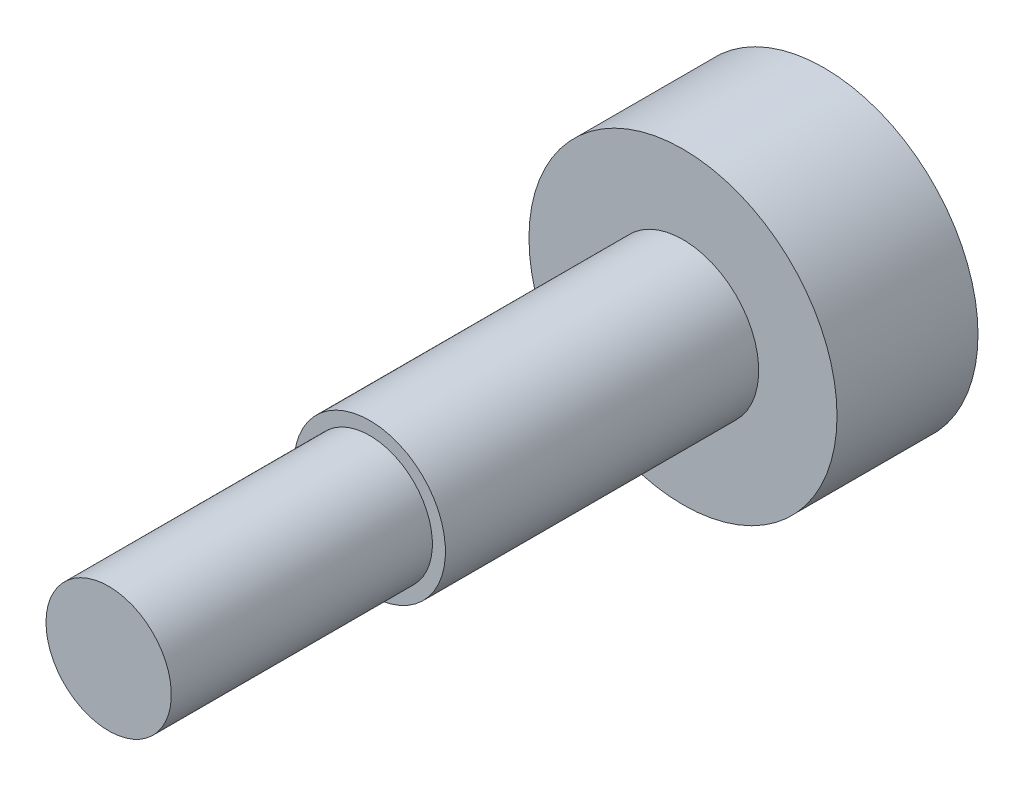
ISO-10303-21;
HEADER;
FILE_DESCRIPTION(('STEP AP214'),'2;1');
FILE_NAME('part.step','',(''),(''),'','','');
FILE_SCHEMA(('AUTOMOTIVE_DESIGN { 1 0 10303 214 1 1 1 1 }'));
ENDSEC;
DATA;
#1=APPLICATION_CONTEXT('core data for automotive mechanical design processes');
#2=APPLICATION_PROTOCOL_DEFINITION('international standard','automotive_design',2000,#1);
#3=PRODUCT_CONTEXT('',#1,'mechanical');
#4=PRODUCT('Part','Part','',(#3));
#5=PRODUCT_RELATED_PRODUCT_CATEGORY('part','',(#4));
#6=PRODUCT_DEFINITION_FORMATION('','',#4);
#7=PRODUCT_DEFINITION_CONTEXT('part definition',#1,'design');
#8=PRODUCT_DEFINITION('design','',#6,#7);
#9=PRODUCT_DEFINITION_SHAPE('','',#8);
#10=(LENGTH_UNIT() NAMED_UNIT(*) SI_UNIT(.MILLI.,.METRE.));
#11=(NAMED_UNIT(*) PLANE_ANGLE_UNIT() SI_UNIT($,.RADIAN.));
#12=(NAMED_UNIT(*) SI_UNIT($,.STERADIAN.) SOLID_ANGLE_UNIT());
#13=UNCERTAINTY_MEASURE_WITH_UNIT(LENGTH_MEASURE(1.E-05),#10,'distance_accuracy_value','');
#14=(GEOMETRIC_REPRESENTATION_CONTEXT(3) GLOBAL_UNCERTAINTY_ASSIGNED_CONTEXT((#13)) GLOBAL_UNIT_ASSIGNED_CONTEXT((#10,
#11,#12)) REPRESENTATION_CONTEXT('',''));
#15=CARTESIAN_POINT('',(0.,0.,0.));
#16=DIRECTION('',(0.,0.,1.));
#17=DIRECTION('',(1.,0.,0.));
#18=AXIS2_PLACEMENT_3D('',#15,#16,#17);
#19=CARTESIAN_POINT('',(0.,0.,-6.));
#20=DIRECTION('',(0.,0.,-1.));
#21=DIRECTION('',(-1.,0.,0.));
#22=AXIS2_PLACEMENT_3D('',#19,#20,#21);
#23=PLANE('',#22);
#24=CARTESIAN_POINT('',(0.,0.,-6.));
#25=DIRECTION('',(0.,0.,-1.));
#26=DIRECTION('',(-1.,0.,0.));
#27=AXIS2_PLACEMENT_3D('',#24,#25,#26);
#28=CIRCLE('',#27,2.95);
#29=CARTESIAN_POINT('',(-2.95,0.,-6.));
#30=VERTEX_POINT('',#29);
#31=EDGE_CURVE('E10',#30,#30,#28,.T.);
#32=ORIENTED_EDGE('',*,*,#31,.F.);
#33=EDGE_LOOP('',(#32));
#34=FACE_BOUND('',#33,.T.);
#35=CARTESIAN_POINT('',(0.,0.,-6.));
#36=DIRECTION('',(0.,0.,-1.));
#37=DIRECTION('',(-1.,0.,0.));
#38=AXIS2_PLACEMENT_3D('',#35,#36,#37);
#39=CIRCLE('',#38,1.45);
#40=CARTESIAN_POINT('',(-1.45,0.,-6.));
#41=VERTEX_POINT('',#40);
#42=EDGE_CURVE('E61',#41,#41,#39,.T.);
#43=ORIENTED_EDGE('',*,*,#42,.T.);
#44=EDGE_LOOP('',(#43));
#45=FACE_BOUND('',#44,.T.);
#46=ADVANCED_FACE('F39',(#34,#45),#23,.F.);
#47=CARTESIAN_POINT('',(0.,0.,-34.4303014203572));
#48=DIRECTION('',(0.,0.,-1.));
#49=DIRECTION('',(-1.,0.,0.));
#50=AXIS2_PLACEMENT_3D('',#47,#48,#49);
#51=CYLINDRICAL_SURFACE('',#50,2.95);
#52=CARTESIAN_POINT('',(0.,0.,-8.7));
#53=DIRECTION('',(0.,0.,-1.));
#54=DIRECTION('',(-1.,0.,0.));
#55=AXIS2_PLACEMENT_3D('',#52,#53,#54);
#56=CIRCLE('',#55,2.95);
#57=CARTESIAN_POINT('',(-2.95,0.,-8.7));
#58=VERTEX_POINT('',#57);
#59=EDGE_CURVE('E45',#58,#58,#56,.T.);
#60=ORIENTED_EDGE('',*,*,#59,.F.);
#61=EDGE_LOOP('',(#60));
#62=FACE_BOUND('',#61,.T.);
#63=ORIENTED_EDGE('',*,*,#31,.T.);
#64=EDGE_LOOP('',(#63));
#65=FACE_BOUND('',#64,.T.);
#66=ADVANCED_FACE('F90',(#62,#65),#51,.T.);
#67=CARTESIAN_POINT('',(0.,0.,-8.7));
#68=DIRECTION('',(0.,0.,-1.));
#69=DIRECTION('',(-1.,0.,0.));
#70=AXIS2_PLACEMENT_3D('',#67,#68,#69);
#71=PLANE('',#70);
#72=ORIENTED_EDGE('',*,*,#59,.T.);
#73=EDGE_LOOP('',(#72));
#74=FACE_BOUND('',#73,.T.);
#75=ADVANCED_FACE('F86',(#74),#71,.T.);
#76=CARTESIAN_POINT('',(0.,0.,5.));
#77=DIRECTION('',(0.,0.,-1.));
#78=DIRECTION('',(-1.,0.,0.));
#79=AXIS2_PLACEMENT_3D('',#76,#77,#78);
#80=PLANE('',#79);
#81=CARTESIAN_POINT('',(0.,0.,5.));
#82=DIRECTION('',(0.,0.,-1.));
#83=DIRECTION('',(-1.,0.,0.));
#84=AXIS2_PLACEMENT_3D('',#81,#82,#83);
#85=CIRCLE('',#84,1.2);
#86=CARTESIAN_POINT('',(-1.2,0.,5.));
#87=VERTEX_POINT('',#86);
#88=EDGE_CURVE('E49',#87,#87,#85,.T.);
#89=ORIENTED_EDGE('',*,*,#88,.F.);
#90=EDGE_LOOP('',(#89));
#91=FACE_BOUND('',#90,.T.);
#92=ADVANCED_FACE('F80',(#91),#80,.F.);
#93=CARTESIAN_POINT('',(0.,0.,-34.4303014203572));
#94=DIRECTION('',(0.,0.,-1.));
#95=DIRECTION('',(-1.,0.,0.));
#96=AXIS2_PLACEMENT_3D('',#93,#94,#95);
#97=CYLINDRICAL_SURFACE('',#96,1.2);
#98=ORIENTED_EDGE('',*,*,#88,.T.);
#99=EDGE_LOOP('',(#98));
#100=FACE_BOUND('',#99,.T.);
#101=CARTESIAN_POINT('',(0.,0.,0.));
#102=DIRECTION('',(0.,0.,-1.));
#103=DIRECTION('',(-1.,0.,0.));
#104=AXIS2_PLACEMENT_3D('',#101,#102,#103);
#105=CIRCLE('',#104,1.2);
#106=CARTESIAN_POINT('',(-1.2,0.,0.));
#107=VERTEX_POINT('',#106);
#108=EDGE_CURVE('E53',#107,#107,#105,.T.);
#109=ORIENTED_EDGE('',*,*,#108,.F.);
#110=EDGE_LOOP('',(#109));
#111=FACE_BOUND('',#110,.T.);
#112=ADVANCED_FACE('F75',(#100,#111),#97,.T.);
#113=CARTESIAN_POINT('',(0.,0.,0.));
#114=DIRECTION('',(0.,0.,-1.));
#115=DIRECTION('',(-1.,0.,0.));
#116=AXIS2_PLACEMENT_3D('',#113,#114,#115);
#117=PLANE('',#116);
#118=CARTESIAN_POINT('',(0.,0.,0.));
#119=DIRECTION('',(0.,0.,-1.));
#120=DIRECTION('',(-1.,0.,0.));
#121=AXIS2_PLACEMENT_3D('',#118,#119,#120);
#122=CIRCLE('',#121,1.45);
#123=CARTESIAN_POINT('',(-1.45,0.,0.));
#124=VERTEX_POINT('',#123);
#125=EDGE_CURVE('E58',#124,#124,#122,.T.);
#126=ORIENTED_EDGE('',*,*,#125,.F.);
#127=EDGE_LOOP('',(#126));
#128=FACE_BOUND('',#127,.T.);
#129=ORIENTED_EDGE('',*,*,#108,.T.);
#130=EDGE_LOOP('',(#129));
#131=FACE_BOUND('',#130,.T.);
#132=ADVANCED_FACE('F69',(#128,#131),#117,.F.);
#133=CARTESIAN_POINT('',(0.,0.,-34.4303014203572));
#134=DIRECTION('',(0.,0.,-1.));
#135=DIRECTION('',(-1.,0.,0.));
#136=AXIS2_PLACEMENT_3D('',#133,#134,#135);
#137=CYLINDRICAL_SURFACE('',#136,1.45);
#138=ORIENTED_EDGE('',*,*,#42,.F.);
#139=EDGE_LOOP('',(#138));
#140=FACE_BOUND('',#139,.T.);
#141=ORIENTED_EDGE('',*,*,#125,.T.);
#142=EDGE_LOOP('',(#141));
#143=FACE_BOUND('',#142,.T.);
#144=ADVANCED_FACE('F66',(#140,#143),#137,.T.);
#145=CLOSED_SHELL('',(#46,#66,#75,#92,#112,#132,#144));
#146=MANIFOLD_SOLID_BREP('B2',#145);
#147=ADVANCED_BREP_SHAPE_REPRESENTATION('',(#18,#146),#14);
#148=SHAPE_DEFINITION_REPRESENTATION(#9,#147);
ENDSEC;
END-ISO-10303-21;
